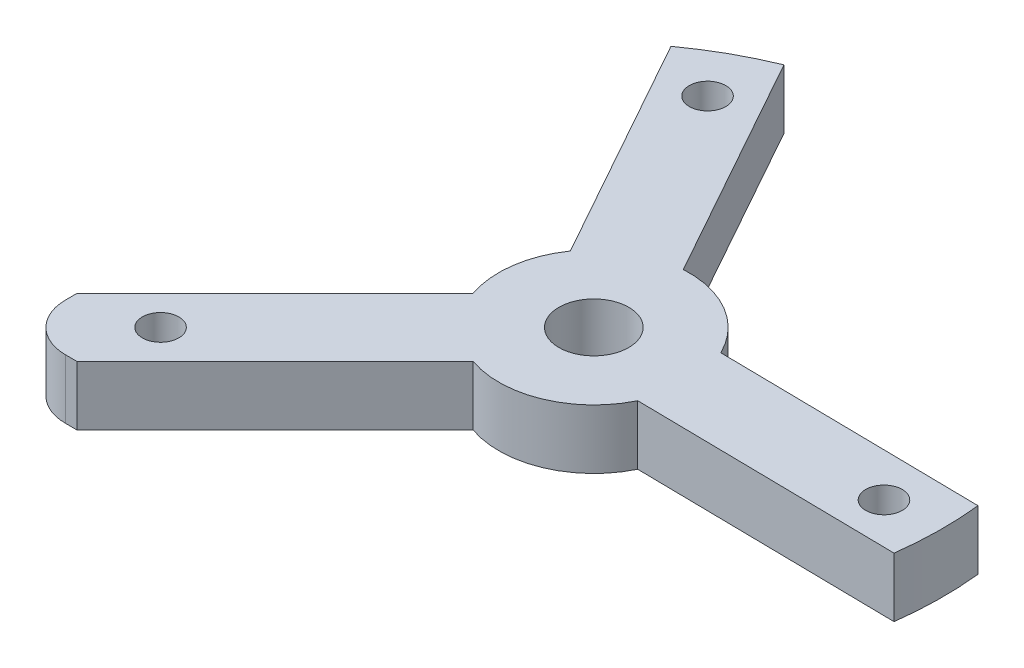
ISO-10303-21;
HEADER;
FILE_DESCRIPTION(('STEP AP214'),'2;1');
FILE_NAME('part.step','',(''),(''),'','','');
FILE_SCHEMA(('AUTOMOTIVE_DESIGN { 1 0 10303 214 1 1 1 1 }'));
ENDSEC;
DATA;
#1=APPLICATION_CONTEXT('core data for automotive mechanical design processes');
#2=APPLICATION_PROTOCOL_DEFINITION('international standard','automotive_design',2000,#1);
#3=PRODUCT_CONTEXT('',#1,'mechanical');
#4=PRODUCT('Part','Part','',(#3));
#5=PRODUCT_RELATED_PRODUCT_CATEGORY('part','',(#4));
#6=PRODUCT_DEFINITION_FORMATION('','',#4);
#7=PRODUCT_DEFINITION_CONTEXT('part definition',#1,'design');
#8=PRODUCT_DEFINITION('design','',#6,#7);
#9=PRODUCT_DEFINITION_SHAPE('','',#8);
#10=(LENGTH_UNIT() NAMED_UNIT(*) SI_UNIT(.MILLI.,.METRE.));
#11=(NAMED_UNIT(*) PLANE_ANGLE_UNIT() SI_UNIT($,.RADIAN.));
#12=(NAMED_UNIT(*) SI_UNIT($,.STERADIAN.) SOLID_ANGLE_UNIT());
#13=UNCERTAINTY_MEASURE_WITH_UNIT(LENGTH_MEASURE(1.E-05),#10,'distance_accuracy_value','');
#14=(GEOMETRIC_REPRESENTATION_CONTEXT(3) GLOBAL_UNCERTAINTY_ASSIGNED_CONTEXT((#13)) GLOBAL_UNIT_ASSIGNED_CONTEXT((#10,
#11,#12)) REPRESENTATION_CONTEXT('',''));
#15=CARTESIAN_POINT('',(0.,0.,0.));
#16=DIRECTION('',(0.,0.,1.));
#17=DIRECTION('',(1.,0.,0.));
#18=AXIS2_PLACEMENT_3D('',#15,#16,#17);
#19=CARTESIAN_POINT('',(49.2406988653593,7.9375,-2.04912565753546E-12));
#20=DIRECTION('',(1.,0.,0.));
#21=DIRECTION('',(0.,0.,-1.));
#22=AXIS2_PLACEMENT_3D('',#19,#20,#21);
#23=PLANE('',#22);
#24=DIRECTION('',(0.,0.,1.));
#25=VECTOR('',#24,1.);
#26=CARTESIAN_POINT('',(49.2406988653593,0.,-2.04912565753546E-12));
#27=LINE('',#26,#25);
#28=CARTESIAN_POINT('',(49.2406988653626,0.,79.0666955925528));
#29=VERTEX_POINT('',#28);
#30=CARTESIAN_POINT('',(49.2406988653626,0.,80.5673765563192));
#31=VERTEX_POINT('',#30);
#32=EDGE_CURVE('E245',#29,#31,#27,.T.);
#33=ORIENTED_EDGE('',*,*,#32,.T.);
#34=DIRECTION('',(0.,-1.,0.));
#35=VECTOR('',#34,1.);
#36=CARTESIAN_POINT('',(49.2406988653626,7.9375,80.5673765563192));
#37=LINE('',#36,#35);
#38=CARTESIAN_POINT('',(49.2406988653626,7.9375,80.5673765563192));
#39=VERTEX_POINT('',#38);
#40=EDGE_CURVE('E11',#39,#31,#37,.T.);
#41=ORIENTED_EDGE('',*,*,#40,.F.);
#42=DIRECTION('',(0.,0.,1.));
#43=VECTOR('',#42,1.);
#44=CARTESIAN_POINT('',(49.2406988653593,7.9375,-2.04912565753546E-12));
#45=LINE('',#44,#43);
#46=CARTESIAN_POINT('',(49.2406988653626,7.9375,79.0666955925528));
#47=VERTEX_POINT('',#46);
#48=EDGE_CURVE('E184',#47,#39,#45,.T.);
#49=ORIENTED_EDGE('',*,*,#48,.F.);
#50=DIRECTION('',(0.,-1.,0.));
#51=VECTOR('',#50,1.);
#52=CARTESIAN_POINT('',(49.2406988653626,7.9375,79.0666955925528));
#53=LINE('',#52,#51);
#54=EDGE_CURVE('E201',#47,#29,#53,.T.);
#55=ORIENTED_EDGE('',*,*,#54,.T.);
#56=EDGE_LOOP('',(#33,#41,#49,#55));
#57=FACE_BOUND('',#56,.T.);
#58=ADVANCED_FACE('F35',(#57),#23,.F.);
#59=CARTESIAN_POINT('',(55.5906988653626,7.9375,80.5673765563192));
#60=DIRECTION('',(0.,-1.,0.));
#61=DIRECTION('',(0.,0.,-1.));
#62=AXIS2_PLACEMENT_3D('',#59,#60,#61);
#63=CYLINDRICAL_SURFACE('',#62,6.35);
#64=CARTESIAN_POINT('',(55.5906988653626,0.,80.5673765563192));
#65=DIRECTION('',(0.,1.,0.));
#66=DIRECTION('',(0.,0.,1.));
#67=AXIS2_PLACEMENT_3D('',#64,#65,#66);
#68=CIRCLE('',#67,6.35);
#69=CARTESIAN_POINT('',(55.5906988653626,0.,86.9173765563192));
#70=VERTEX_POINT('',#69);
#71=EDGE_CURVE('E239',#31,#70,#68,.T.);
#72=ORIENTED_EDGE('',*,*,#71,.T.);
#73=DIRECTION('',(0.,-1.,0.));
#74=VECTOR('',#73,1.);
#75=CARTESIAN_POINT('',(55.5906988653626,7.9375,86.9173765563192));
#76=LINE('',#75,#74);
#77=CARTESIAN_POINT('',(55.5906988653626,7.9375,86.9173765563192));
#78=VERTEX_POINT('',#77);
#79=EDGE_CURVE('E44',#78,#70,#76,.T.);
#80=ORIENTED_EDGE('',*,*,#79,.F.);
#81=CARTESIAN_POINT('',(55.5906988653626,7.9375,80.5673765563192));
#82=DIRECTION('',(0.,1.,0.));
#83=DIRECTION('',(0.,0.,1.));
#84=AXIS2_PLACEMENT_3D('',#81,#82,#83);
#85=CIRCLE('',#84,6.35);
#86=EDGE_CURVE('E113',#39,#78,#85,.T.);
#87=ORIENTED_EDGE('',*,*,#86,.F.);
#88=ORIENTED_EDGE('',*,*,#40,.T.);
#89=EDGE_LOOP('',(#72,#80,#87,#88));
#90=FACE_BOUND('',#89,.T.);
#91=ADVANCED_FACE('F283',(#90),#63,.T.);
#92=CARTESIAN_POINT('',(3.21512949863326E-12,7.9375,86.9173765563213));
#93=DIRECTION('',(0.,0.,-1.));
#94=DIRECTION('',(-1.,0.,0.));
#95=AXIS2_PLACEMENT_3D('',#92,#93,#94);
#96=PLANE('',#95);
#97=DIRECTION('',(1.,0.,0.));
#98=VECTOR('',#97,1.);
#99=CARTESIAN_POINT('',(3.21512949863326E-12,0.,86.9173765563213));
#100=LINE('',#99,#98);
#101=CARTESIAN_POINT('',(57.0913798291288,0.,86.9173765563191));
#102=VERTEX_POINT('',#101);
#103=EDGE_CURVE('E233',#70,#102,#100,.T.);
#104=ORIENTED_EDGE('',*,*,#103,.T.);
#105=DIRECTION('',(0.,-1.,0.));
#106=VECTOR('',#105,1.);
#107=CARTESIAN_POINT('',(57.0913798291288,7.9375,86.9173765563191));
#108=LINE('',#107,#106);
#109=CARTESIAN_POINT('',(57.0913798291288,7.9375,86.9173765563191));
#110=VERTEX_POINT('',#109);
#111=EDGE_CURVE('E225',#110,#102,#108,.T.);
#112=ORIENTED_EDGE('',*,*,#111,.F.);
#113=DIRECTION('',(1.,0.,0.));
#114=VECTOR('',#113,1.);
#115=CARTESIAN_POINT('',(3.21512949863326E-12,7.9375,86.9173765563213));
#116=LINE('',#115,#114);
#117=EDGE_CURVE('E178',#78,#110,#116,.T.);
#118=ORIENTED_EDGE('',*,*,#117,.F.);
#119=ORIENTED_EDGE('',*,*,#79,.T.);
#120=EDGE_LOOP('',(#104,#112,#118,#119));
#121=FACE_BOUND('',#120,.T.);
#122=ADVANCED_FACE('F231',(#121),#96,.F.);
#123=CARTESIAN_POINT('',(72.0043781927241,7.9375,72.0043781927238));
#124=DIRECTION('',(-0.707106781186549,0.,-0.707106781186546));
#125=DIRECTION('',(-0.707106781186546,0.,0.707106781186549));
#126=AXIS2_PLACEMENT_3D('',#123,#124,#125);
#127=PLANE('',#126);
#128=DIRECTION('',(0.707106781186546,0.,-0.707106781186549));
#129=VECTOR('',#128,1.);
#130=CARTESIAN_POINT('',(72.0043781927241,0.,72.0043781927238));
#131=LINE('',#130,#129);
#132=CARTESIAN_POINT('',(83.5720395892618,0.,60.4367167961852));
#133=VERTEX_POINT('',#132);
#134=EDGE_CURVE('E241',#102,#133,#131,.T.);
#135=ORIENTED_EDGE('',*,*,#134,.T.);
#136=DIRECTION('',(0.,-1.,0.));
#137=VECTOR('',#136,1.);
#138=CARTESIAN_POINT('',(83.5720395892618,7.9375,60.4367167961852));
#139=LINE('',#138,#137);
#140=CARTESIAN_POINT('',(83.5720395892618,7.9375,60.4367167961852));
#141=VERTEX_POINT('',#140);
#142=EDGE_CURVE('E222',#141,#133,#139,.T.);
#143=ORIENTED_EDGE('',*,*,#142,.F.);
#144=DIRECTION('',(0.707106781186546,0.,-0.707106781186549));
#145=VECTOR('',#144,1.);
#146=CARTESIAN_POINT('',(72.0043781927241,7.9375,72.0043781927238));
#147=LINE('',#146,#145);
#148=EDGE_CURVE('E174',#110,#141,#147,.T.);
#149=ORIENTED_EDGE('',*,*,#148,.F.);
#150=ORIENTED_EDGE('',*,*,#111,.T.);
#151=EDGE_LOOP('',(#135,#143,#149,#150));
#152=FACE_BOUND('',#151,.T.);
#153=ADVANCED_FACE('F293',(#152),#127,.F.);
#154=CARTESIAN_POINT('',(87.723623156872,7.9375,48.4344522648097));
#155=DIRECTION('',(0.,-1.,0.));
#156=DIRECTION('',(0.,0.,-1.));
#157=AXIS2_PLACEMENT_3D('',#154,#155,#156);
#158=CYLINDRICAL_SURFACE('',#157,12.6999999999973);
#159=CARTESIAN_POINT('',(87.723623156872,0.,48.4344522648097));
#160=DIRECTION('',(0.,1.,0.));
#161=DIRECTION('',(0.,0.,1.));
#162=AXIS2_PLACEMENT_3D('',#159,#160,#161);
#163=CIRCLE('',#162,12.6999999999973);
#164=CARTESIAN_POINT('',(99.1458252732042,0.,53.986325715603));
#165=VERTEX_POINT('',#164);
#166=EDGE_CURVE('E243',#133,#165,#163,.T.);
#167=ORIENTED_EDGE('',*,*,#166,.T.);
#168=DIRECTION('',(0.,-1.,0.));
#169=VECTOR('',#168,1.);
#170=CARTESIAN_POINT('',(99.1458252732042,7.9375,53.986325715603));
#171=LINE('',#170,#169);
#172=CARTESIAN_POINT('',(99.1458252732042,7.9375,53.986325715603));
#173=VERTEX_POINT('',#172);
#174=EDGE_CURVE('E219',#173,#165,#171,.T.);
#175=ORIENTED_EDGE('',*,*,#174,.F.);
#176=CARTESIAN_POINT('',(87.723623156872,7.9375,48.4344522648097));
#177=DIRECTION('',(0.,1.,0.));
#178=DIRECTION('',(0.,0.,1.));
#179=AXIS2_PLACEMENT_3D('',#176,#177,#178);
#180=CIRCLE('',#179,12.6999999999973);
#181=EDGE_CURVE('E166',#141,#173,#180,.T.);
#182=ORIENTED_EDGE('',*,*,#181,.F.);
#183=ORIENTED_EDGE('',*,*,#142,.T.);
#184=EDGE_LOOP('',(#167,#175,#182,#183));
#185=FACE_BOUND('',#184,.T.);
#186=ADVANCED_FACE('F296',(#185),#158,.T.);
#187=CARTESIAN_POINT('',(-0.774474085155043,7.9375,52.5126683121366));
#188=DIRECTION('',(0.0147467248307389,0.,-0.999891261141313));
#189=DIRECTION('',(-0.999891261141314,0.,-0.0147467248307389));
#190=AXIS2_PLACEMENT_3D('',#187,#188,#189);
#191=PLANE('',#190);
#192=DIRECTION('',(0.999891261141314,0.,0.0147467248307389));
#193=VECTOR('',#192,1.);
#194=CARTESIAN_POINT('',(-0.774474085155043,0.,52.5126683121366));
#195=LINE('',#194,#193);
#196=CARTESIAN_POINT('',(133.917161075672,0.,54.4991448000417));
#197=VERTEX_POINT('',#196);
#198=EDGE_CURVE('E250',#165,#197,#195,.T.);
#199=ORIENTED_EDGE('',*,*,#198,.T.);
#200=DIRECTION('',(0.,-1.,0.));
#201=VECTOR('',#200,1.);
#202=CARTESIAN_POINT('',(133.917161075672,7.9375,54.4991448000417));
#203=LINE('',#202,#201);
#204=CARTESIAN_POINT('',(133.917161075672,7.9375,54.4991448000417));
#205=VERTEX_POINT('',#204);
#206=EDGE_CURVE('E216',#205,#197,#203,.T.);
#207=ORIENTED_EDGE('',*,*,#206,.F.);
#208=DIRECTION('',(0.999891261141314,0.,0.0147467248307389));
#209=VECTOR('',#208,1.);
#210=CARTESIAN_POINT('',(-0.774474085155043,7.9375,52.5126683121366));
#211=LINE('',#210,#209);
#212=EDGE_CURVE('E173',#173,#205,#211,.T.);
#213=ORIENTED_EDGE('',*,*,#212,.F.);
#214=ORIENTED_EDGE('',*,*,#174,.T.);
#215=EDGE_LOOP('',(#199,#207,#213,#214));
#216=FACE_BOUND('',#215,.T.);
#217=ADVANCED_FACE('F298',(#216),#191,.F.);
#218=CARTESIAN_POINT('',(87.7236231568722,7.9375,48.4344522648097));
#219=DIRECTION('',(0.,-1.,0.));
#220=DIRECTION('',(0.,0.,-1.));
#221=AXIS2_PLACEMENT_3D('',#218,#219,#220);
#222=CYLINDRICAL_SURFACE('',#221,46.5899499999999);
#223=CARTESIAN_POINT('',(87.7236231568722,0.,48.4344522648097));
#224=DIRECTION('',(0.,1.,0.));
#225=DIRECTION('',(0.,0.,1.));
#226=AXIS2_PLACEMENT_3D('',#223,#224,#225);
#227=CIRCLE('',#226,46.5899499999999);
#228=CARTESIAN_POINT('',(134.040463462214,0.,43.3972164025613));
#229=VERTEX_POINT('',#228);
#230=EDGE_CURVE('E253',#197,#229,#227,.T.);
#231=ORIENTED_EDGE('',*,*,#230,.T.);
#232=DIRECTION('',(0.,-1.,0.));
#233=VECTOR('',#232,1.);
#234=CARTESIAN_POINT('',(134.040463462214,7.9375,43.3972164025613));
#235=LINE('',#234,#233);
#236=CARTESIAN_POINT('',(134.040463462214,7.9375,43.3972164025613));
#237=VERTEX_POINT('',#236);
#238=EDGE_CURVE('E214',#237,#229,#235,.T.);
#239=ORIENTED_EDGE('',*,*,#238,.F.);
#240=CARTESIAN_POINT('',(87.7236231568722,7.9375,48.4344522648097));
#241=DIRECTION('',(0.,1.,0.));
#242=DIRECTION('',(0.,0.,1.));
#243=AXIS2_PLACEMENT_3D('',#240,#241,#242);
#244=CIRCLE('',#243,46.5899499999999);
#245=EDGE_CURVE('E177',#205,#237,#244,.T.);
#246=ORIENTED_EDGE('',*,*,#245,.F.);
#247=ORIENTED_EDGE('',*,*,#206,.T.);
#248=EDGE_LOOP('',(#231,#239,#246,#247));
#249=FACE_BOUND('',#248,.T.);
#250=ADVANCED_FACE('F301',(#249),#222,.T.);
#251=CARTESIAN_POINT('',(-0.610747990331983,7.9375,41.411336096787));
#252=DIRECTION('',(0.0147467248307391,0.,-0.999891261141313));
#253=DIRECTION('',(-0.999891261141314,0.,-0.0147467248307391));
#254=AXIS2_PLACEMENT_3D('',#251,#252,#253);
#255=PLANE('',#254);
#256=DIRECTION('',(0.999891261141314,0.,0.0147467248307391));
#257=VECTOR('',#256,1.);
#258=CARTESIAN_POINT('',(-0.610747990331983,0.,41.411336096787));
#259=LINE('',#258,#257);
#260=CARTESIAN_POINT('',(99.1458252732042,0.,42.8825788140164));
#261=VERTEX_POINT('',#260);
#262=EDGE_CURVE('E256',#261,#229,#259,.T.);
#263=ORIENTED_EDGE('',*,*,#262,.F.);
#264=DIRECTION('',(0.,-1.,0.));
#265=VECTOR('',#264,1.);
#266=CARTESIAN_POINT('',(99.1458252732042,7.9375,42.8825788140164));
#267=LINE('',#266,#265);
#268=CARTESIAN_POINT('',(99.1458252732042,7.9375,42.8825788140164));
#269=VERTEX_POINT('',#268);
#270=EDGE_CURVE('E212',#269,#261,#267,.T.);
#271=ORIENTED_EDGE('',*,*,#270,.F.);
#272=DIRECTION('',(0.999891261141314,0.,0.0147467248307391));
#273=VECTOR('',#272,1.);
#274=CARTESIAN_POINT('',(-0.610747990331983,7.9375,41.411336096787));
#275=LINE('',#274,#273);
#276=EDGE_CURVE('E172',#269,#237,#275,.T.);
#277=ORIENTED_EDGE('',*,*,#276,.T.);
#278=ORIENTED_EDGE('',*,*,#238,.T.);
#279=EDGE_LOOP('',(#263,#271,#277,#278));
#280=FACE_BOUND('',#279,.T.);
#281=ADVANCED_FACE('F305',(#280),#255,.T.);
#282=CARTESIAN_POINT('',(87.0068229340193,0.,35.7546968475911));
#283=VERTEX_POINT('',#282);
#284=EDGE_CURVE('E251',#261,#283,#163,.T.);
#285=ORIENTED_EDGE('',*,*,#284,.T.);
#286=DIRECTION('',(0.,-1.,0.));
#287=VECTOR('',#286,1.);
#288=CARTESIAN_POINT('',(87.0068229340193,7.9375,35.7546968475911));
#289=LINE('',#288,#287);
#290=CARTESIAN_POINT('',(87.0068229340193,7.9375,35.7546968475911));
#291=VERTEX_POINT('',#290);
#292=EDGE_CURVE('E209',#291,#283,#289,.T.);
#293=ORIENTED_EDGE('',*,*,#292,.F.);
#294=EDGE_CURVE('E165',#269,#291,#180,.T.);
#295=ORIENTED_EDGE('',*,*,#294,.F.);
#296=ORIENTED_EDGE('',*,*,#270,.T.);
#297=EDGE_LOOP('',(#285,#293,#295,#296));
#298=FACE_BOUND('',#297,.T.);
#299=ADVANCED_FACE('F309',(#298),#158,.T.);
#300=CARTESIAN_POINT('',(51.1448028364162,7.9375,-28.5312233477353));
#301=DIRECTION('',(-0.873304595585808,0.,0.487174592244616));
#302=DIRECTION('',(0.487174592244616,0.,0.873304595585808));
#303=AXIS2_PLACEMENT_3D('',#300,#301,#302);
#304=PLANE('',#303);
#305=DIRECTION('',(-0.487174592244616,0.,-0.873304595585808));
#306=VECTOR('',#305,1.);
#307=CARTESIAN_POINT('',(51.1448028364162,0.,-28.5312233477353));
#308=LINE('',#307,#306);
#309=CARTESIAN_POINT('',(70.0358277055619,0.,5.33265029464701));
#310=VERTEX_POINT('',#309);
#311=EDGE_CURVE('E259',#283,#310,#308,.T.);
#312=ORIENTED_EDGE('',*,*,#311,.T.);
#313=DIRECTION('',(0.,-1.,0.));
#314=VECTOR('',#313,1.);
#315=CARTESIAN_POINT('',(70.0358277055619,7.9375,5.33265029464701));
#316=LINE('',#315,#314);
#317=CARTESIAN_POINT('',(70.0358277055619,7.9375,5.33265029464701));
#318=VERTEX_POINT('',#317);
#319=EDGE_CURVE('E206',#318,#310,#316,.T.);
#320=ORIENTED_EDGE('',*,*,#319,.F.);
#321=DIRECTION('',(-0.487174592244616,0.,-0.873304595585808));
#322=VECTOR('',#321,1.);
#323=CARTESIAN_POINT('',(51.1448028364162,7.9375,-28.5312233477353));
#324=LINE('',#323,#322);
#325=EDGE_CURVE('E171',#291,#318,#324,.T.);
#326=ORIENTED_EDGE('',*,*,#325,.F.);
#327=ORIENTED_EDGE('',*,*,#292,.T.);
#328=EDGE_LOOP('',(#312,#320,#326,#327));
#329=FACE_BOUND('',#328,.T.);
#330=ADVANCED_FACE('F311',(#329),#304,.F.);
#331=CARTESIAN_POINT('',(87.7236231568722,7.9375,48.4344522648097));
#332=DIRECTION('',(0.,-1.,0.));
#333=DIRECTION('',(0.,0.,-1.));
#334=AXIS2_PLACEMENT_3D('',#331,#332,#333);
#335=CYLINDRICAL_SURFACE('',#334,46.5899500000002);
#336=CARTESIAN_POINT('',(87.7236231568722,0.,48.4344522648097));
#337=DIRECTION('',(0.,1.,0.));
#338=DIRECTION('',(0.,0.,1.));
#339=AXIS2_PLACEMENT_3D('',#336,#337,#338);
#340=CIRCLE('',#339,46.5899500000002);
#341=CARTESIAN_POINT('',(60.339928943807,0.,10.7415254449426));
#342=VERTEX_POINT('',#341);
#343=EDGE_CURVE('E261',#310,#342,#340,.T.);
#344=ORIENTED_EDGE('',*,*,#343,.T.);
#345=DIRECTION('',(0.,-1.,0.));
#346=VECTOR('',#345,1.);
#347=CARTESIAN_POINT('',(60.339928943807,7.9375,10.7415254449426));
#348=LINE('',#347,#346);
#349=CARTESIAN_POINT('',(60.339928943807,7.9375,10.7415254449426));
#350=VERTEX_POINT('',#349);
#351=EDGE_CURVE('E160',#350,#342,#348,.T.);
#352=ORIENTED_EDGE('',*,*,#351,.F.);
#353=CARTESIAN_POINT('',(87.7236231568722,7.9375,48.4344522648097));
#354=DIRECTION('',(0.,1.,0.));
#355=DIRECTION('',(0.,0.,1.));
#356=AXIS2_PLACEMENT_3D('',#353,#354,#355);
#357=CIRCLE('',#356,46.5899500000002);
#358=EDGE_CURVE('E151',#318,#350,#357,.T.);
#359=ORIENTED_EDGE('',*,*,#358,.F.);
#360=ORIENTED_EDGE('',*,*,#319,.T.);
#361=EDGE_LOOP('',(#344,#352,#359,#360));
#362=FACE_BOUND('',#361,.T.);
#363=ADVANCED_FACE('F314',(#362),#335,.T.);
#364=CARTESIAN_POINT('',(41.4489040746613,7.9375,-23.1223481974397));
#365=DIRECTION('',(0.873304595585808,0.,-0.487174592244616));
#366=DIRECTION('',(-0.487174592244616,0.,-0.873304595585808));
#367=AXIS2_PLACEMENT_3D('',#364,#365,#366);
#368=PLANE('',#367);
#369=DIRECTION('',(0.487174592244616,0.,0.873304595585808));
#370=VECTOR('',#369,1.);
#371=CARTESIAN_POINT('',(41.4489040746613,0.,-23.1223481974397));
#372=LINE('',#371,#370);
#373=CARTESIAN_POINT('',(77.3109241722655,0.,41.1635719978861));
#374=VERTEX_POINT('',#373);
#375=EDGE_CURVE('E159',#342,#374,#372,.T.);
#376=ORIENTED_EDGE('',*,*,#375,.T.);
#377=DIRECTION('',(0.,-1.,0.));
#378=VECTOR('',#377,1.);
#379=CARTESIAN_POINT('',(77.3109241722655,7.9375,41.1635719978861));
#380=LINE('',#379,#378);
#381=CARTESIAN_POINT('',(77.3109241722655,7.9375,41.1635719978861));
#382=VERTEX_POINT('',#381);
#383=EDGE_CURVE('E156',#382,#374,#380,.T.);
#384=ORIENTED_EDGE('',*,*,#383,.F.);
#385=DIRECTION('',(0.487174592244616,0.,0.873304595585808));
#386=VECTOR('',#385,1.);
#387=CARTESIAN_POINT('',(41.4489040746613,7.9375,-23.1223481974397));
#388=LINE('',#387,#386);
#389=EDGE_CURVE('E144',#350,#382,#388,.T.);
#390=ORIENTED_EDGE('',*,*,#389,.F.);
#391=ORIENTED_EDGE('',*,*,#351,.T.);
#392=EDGE_LOOP('',(#376,#384,#390,#391));
#393=FACE_BOUND('',#392,.T.);
#394=ADVANCED_FACE('F157',(#393),#368,.F.);
#395=CARTESIAN_POINT('',(75.7213586254965,0.,52.5860358324196));
#396=VERTEX_POINT('',#395);
#397=EDGE_CURVE('E99',#374,#396,#163,.T.);
#398=ORIENTED_EDGE('',*,*,#397,.T.);
#399=DIRECTION('',(0.,-1.,0.));
#400=VECTOR('',#399,1.);
#401=CARTESIAN_POINT('',(75.7213586254965,7.9375,52.5860358324196));
#402=LINE('',#401,#400);
#403=CARTESIAN_POINT('',(75.7213586254965,7.9375,52.5860358324196));
#404=VERTEX_POINT('',#403);
#405=EDGE_CURVE('E161',#404,#396,#402,.T.);
#406=ORIENTED_EDGE('',*,*,#405,.F.);
#407=EDGE_CURVE('E149',#382,#404,#180,.T.);
#408=ORIENTED_EDGE('',*,*,#407,.F.);
#409=ORIENTED_EDGE('',*,*,#383,.T.);
#410=EDGE_LOOP('',(#398,#406,#408,#409));
#411=FACE_BOUND('',#410,.T.);
#412=ADVANCED_FACE('F163',(#411),#158,.T.);
#413=CARTESIAN_POINT('',(68.5435594602015,7.9375,14.0524503365964));
#414=DIRECTION('',(0.,-1.,0.));
#415=DIRECTION('',(0.,0.,-1.));
#416=AXIS2_PLACEMENT_3D('',#413,#414,#415);
#417=CYLINDRICAL_SURFACE('',#416,2.4384);
#418=CARTESIAN_POINT('',(68.5435594602015,7.9375,14.0524503365964));
#419=DIRECTION('',(0.,1.,0.));
#420=DIRECTION('',(0.,0.,1.));
#421=AXIS2_PLACEMENT_3D('',#418,#419,#420);
#422=CIRCLE('',#421,2.4384);
#423=CARTESIAN_POINT('',(68.5435594602015,7.9375,16.4908503365964));
#424=VERTEX_POINT('',#423);
#425=EDGE_CURVE('E343',#424,#424,#422,.T.);
#426=ORIENTED_EDGE('',*,*,#425,.T.);
#427=EDGE_LOOP('',(#426));
#428=FACE_BOUND('',#427,.T.);
#429=CARTESIAN_POINT('',(68.5435594602015,0.,14.0524503365964));
#430=DIRECTION('',(0.,1.,0.));
#431=DIRECTION('',(0.,0.,1.));
#432=AXIS2_PLACEMENT_3D('',#429,#430,#431);
#433=CIRCLE('',#432,2.4384);
#434=CARTESIAN_POINT('',(68.5435594602015,0.,16.4908503365964));
#435=VERTEX_POINT('',#434);
#436=EDGE_CURVE('E192',#435,#435,#433,.T.);
#437=ORIENTED_EDGE('',*,*,#436,.F.);
#438=EDGE_LOOP('',(#437));
#439=FACE_BOUND('',#438,.T.);
#440=ADVANCED_FACE('F271',(#428,#439),#417,.F.);
#441=CARTESIAN_POINT('',(87.723623156872,7.9375,48.4344522648097));
#442=DIRECTION('',(0.,-1.,0.));
#443=DIRECTION('',(0.,0.,-1.));
#444=AXIS2_PLACEMENT_3D('',#441,#442,#443);
#445=CYLINDRICAL_SURFACE('',#444,4.66724999999725);
#446=CARTESIAN_POINT('',(87.723623156872,7.9375,48.4344522648097));
#447=DIRECTION('',(0.,1.,0.));
#448=DIRECTION('',(0.,0.,1.));
#449=AXIS2_PLACEMENT_3D('',#446,#447,#448);
#450=CIRCLE('',#449,4.66724999999725);
#451=CARTESIAN_POINT('',(87.723623156872,7.9375,53.1017022648069));
#452=VERTEX_POINT('',#451);
#453=EDGE_CURVE('E167',#452,#452,#450,.T.);
#454=ORIENTED_EDGE('',*,*,#453,.T.);
#455=EDGE_LOOP('',(#454));
#456=FACE_BOUND('',#455,.T.);
#457=CARTESIAN_POINT('',(87.723623156872,0.,48.4344522648097));
#458=DIRECTION('',(0.,1.,0.));
#459=DIRECTION('',(0.,0.,1.));
#460=AXIS2_PLACEMENT_3D('',#457,#458,#459);
#461=CIRCLE('',#460,4.66724999999725);
#462=CARTESIAN_POINT('',(87.723623156872,0.,53.1017022648069));
#463=VERTEX_POINT('',#462);
#464=EDGE_CURVE('E197',#463,#463,#461,.T.);
#465=ORIENTED_EDGE('',*,*,#464,.F.);
#466=EDGE_LOOP('',(#465));
#467=FACE_BOUND('',#466,.T.);
#468=ADVANCED_FACE('F268',(#456,#467),#445,.F.);
#469=CARTESIAN_POINT('',(64.1536972289578,7.9375,64.1536972289575));
#470=DIRECTION('',(0.707106781186549,0.,0.707106781186546));
#471=DIRECTION('',(0.707106781186546,0.,-0.707106781186549));
#472=AXIS2_PLACEMENT_3D('',#469,#470,#471);
#473=PLANE('',#472);
#474=DIRECTION('',(-0.707106781186546,0.,0.707106781186549));
#475=VECTOR('',#474,1.);
#476=CARTESIAN_POINT('',(64.1536972289578,0.,64.1536972289575));
#477=LINE('',#476,#475);
#478=EDGE_CURVE('E105',#396,#29,#477,.T.);
#479=ORIENTED_EDGE('',*,*,#478,.T.);
#480=ORIENTED_EDGE('',*,*,#54,.F.);
#481=DIRECTION('',(-0.707106781186546,0.,0.707106781186549));
#482=VECTOR('',#481,1.);
#483=CARTESIAN_POINT('',(64.1536972289578,7.9375,64.1536972289575));
#484=LINE('',#483,#482);
#485=EDGE_CURVE('E52',#404,#47,#484,.T.);
#486=ORIENTED_EDGE('',*,*,#485,.F.);
#487=ORIENTED_EDGE('',*,*,#405,.T.);
#488=EDGE_LOOP('',(#479,#480,#486,#487));
#489=FACE_BOUND('',#488,.T.);
#490=ADVANCED_FACE('F270',(#489),#473,.F.);
#491=CARTESIAN_POINT('',(58.7656988653626,7.9375,77.3923765563192));
#492=DIRECTION('',(0.,-1.,0.));
#493=DIRECTION('',(0.,0.,-1.));
#494=AXIS2_PLACEMENT_3D('',#491,#492,#493);
#495=CYLINDRICAL_SURFACE('',#494,2.4384);
#496=CARTESIAN_POINT('',(58.7656988653626,7.9375,77.3923765563192));
#497=DIRECTION('',(0.,1.,0.));
#498=DIRECTION('',(0.,0.,1.));
#499=AXIS2_PLACEMENT_3D('',#496,#497,#498);
#500=CIRCLE('',#499,2.4384);
#501=CARTESIAN_POINT('',(58.7656988653626,7.9375,79.8307765563192));
#502=VERTEX_POINT('',#501);
#503=EDGE_CURVE('E186',#502,#502,#500,.T.);
#504=ORIENTED_EDGE('',*,*,#503,.T.);
#505=EDGE_LOOP('',(#504));
#506=FACE_BOUND('',#505,.T.);
#507=CARTESIAN_POINT('',(58.7656988653626,0.,77.3923765563192));
#508=DIRECTION('',(0.,1.,0.));
#509=DIRECTION('',(0.,0.,1.));
#510=AXIS2_PLACEMENT_3D('',#507,#508,#509);
#511=CIRCLE('',#510,2.4384);
#512=CARTESIAN_POINT('',(58.7656988653626,0.,79.8307765563192));
#513=VERTEX_POINT('',#512);
#514=EDGE_CURVE('E348',#513,#513,#511,.T.);
#515=ORIENTED_EDGE('',*,*,#514,.F.);
#516=EDGE_LOOP('',(#515));
#517=FACE_BOUND('',#516,.T.);
#518=ADVANCED_FACE('F37',(#506,#517),#495,.F.);
#519=CARTESIAN_POINT('',(127.089342108006,7.9375,49.0150308213959));
#520=DIRECTION('',(0.,-1.,0.));
#521=DIRECTION('',(0.,0.,-1.));
#522=AXIS2_PLACEMENT_3D('',#519,#520,#521);
#523=CYLINDRICAL_SURFACE('',#522,2.43839999999725);
#524=CARTESIAN_POINT('',(127.089342108006,7.9375,49.0150308213959));
#525=DIRECTION('',(0.,1.,0.));
#526=DIRECTION('',(0.,0.,1.));
#527=AXIS2_PLACEMENT_3D('',#524,#525,#526);
#528=CIRCLE('',#527,2.43839999999725);
#529=CARTESIAN_POINT('',(127.089342108006,7.9375,51.4534308213931));
#530=VERTEX_POINT('',#529);
#531=EDGE_CURVE('E203',#530,#530,#528,.T.);
#532=ORIENTED_EDGE('',*,*,#531,.T.);
#533=EDGE_LOOP('',(#532));
#534=FACE_BOUND('',#533,.T.);
#535=CARTESIAN_POINT('',(127.089342108006,0.,49.0150308213959));
#536=DIRECTION('',(0.,1.,0.));
#537=DIRECTION('',(0.,0.,1.));
#538=AXIS2_PLACEMENT_3D('',#535,#536,#537);
#539=CIRCLE('',#538,2.43839999999725);
#540=CARTESIAN_POINT('',(127.089342108006,0.,51.4534308213931));
#541=VERTEX_POINT('',#540);
#542=EDGE_CURVE('E188',#541,#541,#539,.T.);
#543=ORIENTED_EDGE('',*,*,#542,.F.);
#544=EDGE_LOOP('',(#543));
#545=FACE_BOUND('',#544,.T.);
#546=ADVANCED_FACE('F365',(#534,#545),#523,.F.);
#547=CARTESIAN_POINT('',(0.,7.9375,0.));
#548=DIRECTION('',(0.,1.,0.));
#549=DIRECTION('',(0.,0.,1.));
#550=AXIS2_PLACEMENT_3D('',#547,#548,#549);
#551=PLANE('',#550);
#552=ORIENTED_EDGE('',*,*,#503,.F.);
#553=EDGE_LOOP('',(#552));
#554=FACE_BOUND('',#553,.T.);
#555=ORIENTED_EDGE('',*,*,#48,.T.);
#556=ORIENTED_EDGE('',*,*,#86,.T.);
#557=ORIENTED_EDGE('',*,*,#117,.T.);
#558=ORIENTED_EDGE('',*,*,#148,.T.);
#559=ORIENTED_EDGE('',*,*,#181,.T.);
#560=ORIENTED_EDGE('',*,*,#212,.T.);
#561=ORIENTED_EDGE('',*,*,#245,.T.);
#562=ORIENTED_EDGE('',*,*,#276,.F.);
#563=ORIENTED_EDGE('',*,*,#294,.T.);
#564=ORIENTED_EDGE('',*,*,#325,.T.);
#565=ORIENTED_EDGE('',*,*,#358,.T.);
#566=ORIENTED_EDGE('',*,*,#389,.T.);
#567=ORIENTED_EDGE('',*,*,#407,.T.);
#568=ORIENTED_EDGE('',*,*,#485,.T.);
#569=EDGE_LOOP('',(#555,#556,#557,#558,#559,#560,#561,#562,#563,#564,#565,#566,#567,#568));
#570=FACE_BOUND('',#569,.T.);
#571=ORIENTED_EDGE('',*,*,#453,.F.);
#572=EDGE_LOOP('',(#571));
#573=FACE_BOUND('',#572,.T.);
#574=ORIENTED_EDGE('',*,*,#425,.F.);
#575=EDGE_LOOP('',(#574));
#576=FACE_BOUND('',#575,.T.);
#577=ORIENTED_EDGE('',*,*,#531,.F.);
#578=EDGE_LOOP('',(#577));
#579=FACE_BOUND('',#578,.T.);
#580=ADVANCED_FACE('F146',(#554,#570,#573,#576,#579),#551,.T.);
#581=CARTESIAN_POINT('',(0.,0.,0.));
#582=DIRECTION('',(0.,1.,0.));
#583=DIRECTION('',(0.,0.,1.));
#584=AXIS2_PLACEMENT_3D('',#581,#582,#583);
#585=PLANE('',#584);
#586=ORIENTED_EDGE('',*,*,#514,.T.);
#587=EDGE_LOOP('',(#586));
#588=FACE_BOUND('',#587,.T.);
#589=ORIENTED_EDGE('',*,*,#32,.F.);
#590=ORIENTED_EDGE('',*,*,#478,.F.);
#591=ORIENTED_EDGE('',*,*,#397,.F.);
#592=ORIENTED_EDGE('',*,*,#375,.F.);
#593=ORIENTED_EDGE('',*,*,#343,.F.);
#594=ORIENTED_EDGE('',*,*,#311,.F.);
#595=ORIENTED_EDGE('',*,*,#284,.F.);
#596=ORIENTED_EDGE('',*,*,#262,.T.);
#597=ORIENTED_EDGE('',*,*,#230,.F.);
#598=ORIENTED_EDGE('',*,*,#198,.F.);
#599=ORIENTED_EDGE('',*,*,#166,.F.);
#600=ORIENTED_EDGE('',*,*,#134,.F.);
#601=ORIENTED_EDGE('',*,*,#103,.F.);
#602=ORIENTED_EDGE('',*,*,#71,.F.);
#603=EDGE_LOOP('',(#589,#590,#591,#592,#593,#594,#595,#596,#597,#598,#599,#600,#601,#602));
#604=FACE_BOUND('',#603,.T.);
#605=ORIENTED_EDGE('',*,*,#464,.T.);
#606=EDGE_LOOP('',(#605));
#607=FACE_BOUND('',#606,.T.);
#608=ORIENTED_EDGE('',*,*,#436,.T.);
#609=EDGE_LOOP('',(#608));
#610=FACE_BOUND('',#609,.T.);
#611=ORIENTED_EDGE('',*,*,#542,.T.);
#612=EDGE_LOOP('',(#611));
#613=FACE_BOUND('',#612,.T.);
#614=ADVANCED_FACE('F237',(#588,#604,#607,#610,#613),#585,.F.);
#615=CLOSED_SHELL('',(#58,#91,#122,#153,#186,#217,#250,#281,#299,#330,#363,#394,#412,#440,#468,
#490,#518,#546,#580,#614));
#616=MANIFOLD_SOLID_BREP('B2',#615);
#617=ADVANCED_BREP_SHAPE_REPRESENTATION('',(#18,#616),#14);
#618=SHAPE_DEFINITION_REPRESENTATION(#9,#617);
ENDSEC;
END-ISO-10303-21;
